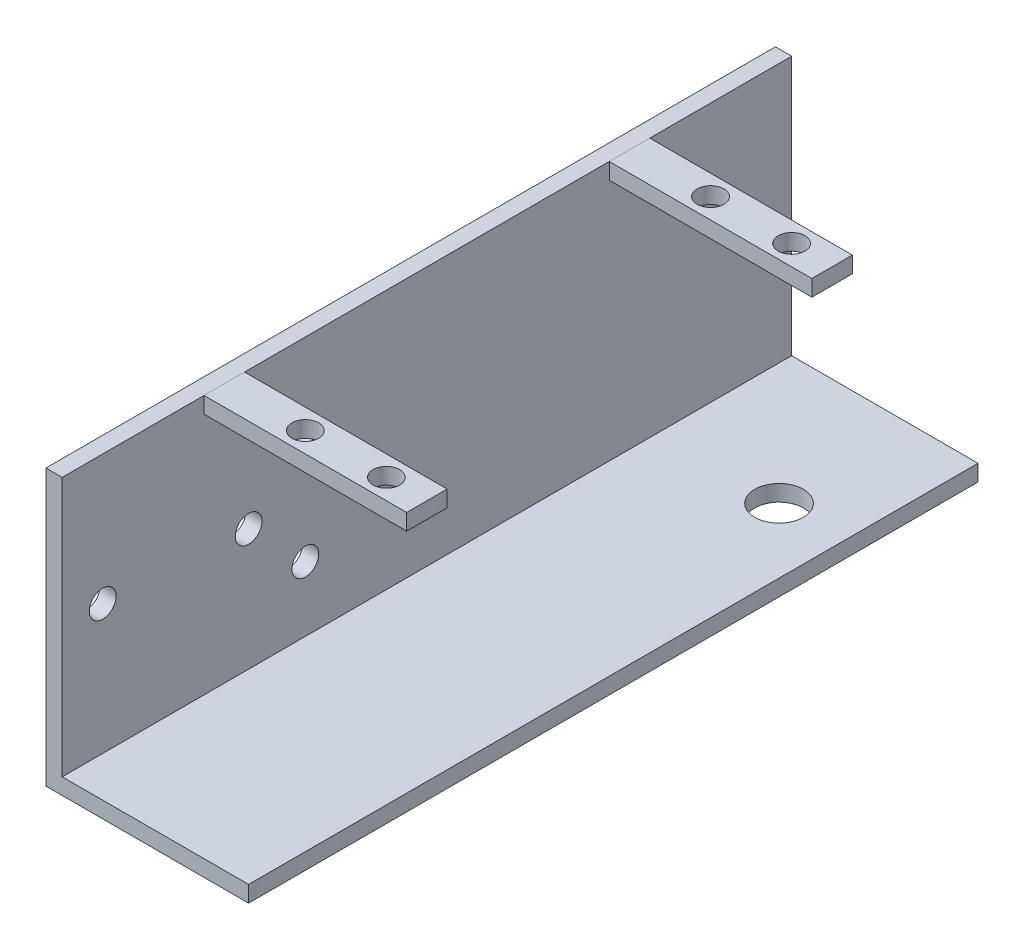
ISO-10303-21;
HEADER;
FILE_DESCRIPTION(('STEP AP214'),'2;1');
FILE_NAME('part.step','',(''),(''),'','','');
FILE_SCHEMA(('AUTOMOTIVE_DESIGN { 1 0 10303 214 1 1 1 1 }'));
ENDSEC;
DATA;
#1=APPLICATION_CONTEXT('core data for automotive mechanical design processes');
#2=APPLICATION_PROTOCOL_DEFINITION('international standard','automotive_design',2000,#1);
#3=PRODUCT_CONTEXT('',#1,'mechanical');
#4=PRODUCT('Part','Part','',(#3));
#5=PRODUCT_RELATED_PRODUCT_CATEGORY('part','',(#4));
#6=PRODUCT_DEFINITION_FORMATION('','',#4);
#7=PRODUCT_DEFINITION_CONTEXT('part definition',#1,'design');
#8=PRODUCT_DEFINITION('design','',#6,#7);
#9=PRODUCT_DEFINITION_SHAPE('','',#8);
#10=(LENGTH_UNIT() NAMED_UNIT(*) SI_UNIT(.MILLI.,.METRE.));
#11=(NAMED_UNIT(*) PLANE_ANGLE_UNIT() SI_UNIT($,.RADIAN.));
#12=(NAMED_UNIT(*) SI_UNIT($,.STERADIAN.) SOLID_ANGLE_UNIT());
#13=UNCERTAINTY_MEASURE_WITH_UNIT(LENGTH_MEASURE(1.E-05),#10,'distance_accuracy_value','');
#14=(GEOMETRIC_REPRESENTATION_CONTEXT(3) GLOBAL_UNCERTAINTY_ASSIGNED_CONTEXT((#13)) GLOBAL_UNIT_ASSIGNED_CONTEXT((#10,
#11,#12)) REPRESENTATION_CONTEXT('',''));
#15=CARTESIAN_POINT('',(0.,0.,0.));
#16=DIRECTION('',(0.,0.,1.));
#17=DIRECTION('',(1.,0.,0.));
#18=AXIS2_PLACEMENT_3D('',#15,#16,#17);
#19=CARTESIAN_POINT('',(14.5,32.,-22.5));
#20=DIRECTION('',(0.,0.,-1.));
#21=DIRECTION('',(0.,1.,0.));
#22=AXIS2_PLACEMENT_3D('',#19,#20,#21);
#23=PLANE('',#22);
#24=DIRECTION('',(0.,-1.,0.));
#25=VECTOR('',#24,1.);
#26=CARTESIAN_POINT('',(-10.5,32.,-22.5));
#27=LINE('',#26,#25);
#28=CARTESIAN_POINT('',(-10.5,34.,-22.5));
#29=VERTEX_POINT('',#28);
#30=CARTESIAN_POINT('',(-10.5,32.,-22.5));
#31=VERTEX_POINT('',#30);
#32=EDGE_CURVE('E113',#29,#31,#27,.T.);
#33=ORIENTED_EDGE('',*,*,#32,.T.);
#34=DIRECTION('',(-1.,0.,0.));
#35=VECTOR('',#34,1.);
#36=CARTESIAN_POINT('',(14.5,32.,-22.5));
#37=LINE('',#36,#35);
#38=CARTESIAN_POINT('',(14.5,32.,-22.5));
#39=VERTEX_POINT('',#38);
#40=EDGE_CURVE('E12',#39,#31,#37,.T.);
#41=ORIENTED_EDGE('',*,*,#40,.F.);
#42=DIRECTION('',(0.,-1.,0.));
#43=VECTOR('',#42,1.);
#44=CARTESIAN_POINT('',(14.5,32.,-22.5));
#45=LINE('',#44,#43);
#46=CARTESIAN_POINT('',(14.5,34.,-22.5));
#47=VERTEX_POINT('',#46);
#48=EDGE_CURVE('E101',#47,#39,#45,.T.);
#49=ORIENTED_EDGE('',*,*,#48,.F.);
#50=DIRECTION('',(-1.,0.,0.));
#51=VECTOR('',#50,1.);
#52=CARTESIAN_POINT('',(14.5,34.,-22.5));
#53=LINE('',#52,#51);
#54=EDGE_CURVE('E109',#47,#29,#53,.T.);
#55=ORIENTED_EDGE('',*,*,#54,.T.);
#56=EDGE_LOOP('',(#33,#41,#49,#55));
#57=FACE_BOUND('',#56,.T.);
#58=ADVANCED_FACE('F50',(#57),#23,.F.);
#59=CARTESIAN_POINT('',(14.5,32.,-22.5));
#60=DIRECTION('',(0.,1.,0.));
#61=DIRECTION('',(0.,0.,1.));
#62=AXIS2_PLACEMENT_3D('',#59,#60,#61);
#63=PLANE('',#62);
#64=CARTESIAN_POINT('',(9.50000000000001,32.,-25.));
#65=DIRECTION('',(0.,1.,0.));
#66=DIRECTION('',(0.,0.,1.));
#67=AXIS2_PLACEMENT_3D('',#64,#65,#66);
#68=CIRCLE('',#67,1.65);
#69=CARTESIAN_POINT('',(9.50000000000001,32.,-23.35));
#70=VERTEX_POINT('',#69);
#71=EDGE_CURVE('E116',#70,#70,#68,.F.);
#72=ORIENTED_EDGE('',*,*,#71,.F.);
#73=EDGE_LOOP('',(#72));
#74=FACE_BOUND('',#73,.T.);
#75=CARTESIAN_POINT('',(-0.499999999999994,32.,-25.));
#76=DIRECTION('',(0.,1.,0.));
#77=DIRECTION('',(0.,0.,1.));
#78=AXIS2_PLACEMENT_3D('',#75,#76,#77);
#79=CIRCLE('',#78,1.65);
#80=CARTESIAN_POINT('',(-0.499999999999994,32.,-23.35));
#81=VERTEX_POINT('',#80);
#82=EDGE_CURVE('E127',#81,#81,#79,.F.);
#83=ORIENTED_EDGE('',*,*,#82,.F.);
#84=EDGE_LOOP('',(#83));
#85=FACE_BOUND('',#84,.T.);
#86=DIRECTION('',(0.,0.,-1.));
#87=VECTOR('',#86,1.);
#88=CARTESIAN_POINT('',(-10.5,32.,-22.5));
#89=LINE('',#88,#87);
#90=CARTESIAN_POINT('',(-10.5,32.,-27.5));
#91=VERTEX_POINT('',#90);
#92=EDGE_CURVE('E105',#31,#91,#89,.T.);
#93=ORIENTED_EDGE('',*,*,#92,.T.);
#94=DIRECTION('',(-1.,0.,0.));
#95=VECTOR('',#94,1.);
#96=CARTESIAN_POINT('',(14.5,32.,-27.5));
#97=LINE('',#96,#95);
#98=CARTESIAN_POINT('',(14.5,32.,-27.5));
#99=VERTEX_POINT('',#98);
#100=EDGE_CURVE('E58',#99,#91,#97,.T.);
#101=ORIENTED_EDGE('',*,*,#100,.F.);
#102=DIRECTION('',(0.,0.,-1.));
#103=VECTOR('',#102,1.);
#104=CARTESIAN_POINT('',(14.5,32.,-22.5));
#105=LINE('',#104,#103);
#106=EDGE_CURVE('E96',#39,#99,#105,.T.);
#107=ORIENTED_EDGE('',*,*,#106,.F.);
#108=ORIENTED_EDGE('',*,*,#40,.T.);
#109=EDGE_LOOP('',(#93,#101,#107,#108));
#110=FACE_BOUND('',#109,.T.);
#111=ADVANCED_FACE('F104',(#74,#85,#110),#63,.F.);
#112=CARTESIAN_POINT('',(14.5,32.,-27.5));
#113=DIRECTION('',(0.,0.,1.));
#114=DIRECTION('',(1.,0.,0.));
#115=AXIS2_PLACEMENT_3D('',#112,#113,#114);
#116=PLANE('',#115);
#117=DIRECTION('',(0.,1.,0.));
#118=VECTOR('',#117,1.);
#119=CARTESIAN_POINT('',(-10.5,32.,-27.5));
#120=LINE('',#119,#118);
#121=CARTESIAN_POINT('',(-10.5,34.,-27.5));
#122=VERTEX_POINT('',#121);
#123=EDGE_CURVE('E83',#91,#122,#120,.T.);
#124=ORIENTED_EDGE('',*,*,#123,.T.);
#125=DIRECTION('',(-1.,0.,0.));
#126=VECTOR('',#125,1.);
#127=CARTESIAN_POINT('',(14.5,34.,-27.5));
#128=LINE('',#127,#126);
#129=CARTESIAN_POINT('',(14.5,34.,-27.5));
#130=VERTEX_POINT('',#129);
#131=EDGE_CURVE('E106',#130,#122,#128,.T.);
#132=ORIENTED_EDGE('',*,*,#131,.F.);
#133=DIRECTION('',(0.,1.,0.));
#134=VECTOR('',#133,1.);
#135=CARTESIAN_POINT('',(14.5,32.,-27.5));
#136=LINE('',#135,#134);
#137=EDGE_CURVE('E99',#99,#130,#136,.T.);
#138=ORIENTED_EDGE('',*,*,#137,.F.);
#139=ORIENTED_EDGE('',*,*,#100,.T.);
#140=EDGE_LOOP('',(#124,#132,#138,#139));
#141=FACE_BOUND('',#140,.T.);
#142=ADVANCED_FACE('F107',(#141),#116,.F.);
#143=CARTESIAN_POINT('',(14.5,34.,-22.5));
#144=DIRECTION('',(0.,-1.,0.));
#145=DIRECTION('',(0.,0.,-1.));
#146=AXIS2_PLACEMENT_3D('',#143,#144,#145);
#147=PLANE('',#146);
#148=CARTESIAN_POINT('',(9.50000000000001,34.,-25.));
#149=DIRECTION('',(0.,1.,0.));
#150=DIRECTION('',(0.,0.,-1.));
#151=AXIS2_PLACEMENT_3D('',#148,#149,#150);
#152=CIRCLE('',#151,1.65);
#153=CARTESIAN_POINT('',(9.50000000000001,34.,-26.65));
#154=VERTEX_POINT('',#153);
#155=EDGE_CURVE('E130',#154,#154,#152,.T.);
#156=ORIENTED_EDGE('',*,*,#155,.F.);
#157=EDGE_LOOP('',(#156));
#158=FACE_BOUND('',#157,.T.);
#159=CARTESIAN_POINT('',(-0.499999999999994,34.,-25.));
#160=DIRECTION('',(0.,1.,0.));
#161=DIRECTION('',(0.,0.,-1.));
#162=AXIS2_PLACEMENT_3D('',#159,#160,#161);
#163=CIRCLE('',#162,1.65);
#164=CARTESIAN_POINT('',(-0.499999999999994,34.,-26.65));
#165=VERTEX_POINT('',#164);
#166=EDGE_CURVE('E131',#165,#165,#163,.T.);
#167=ORIENTED_EDGE('',*,*,#166,.F.);
#168=EDGE_LOOP('',(#167));
#169=FACE_BOUND('',#168,.T.);
#170=DIRECTION('',(0.,0.,1.));
#171=VECTOR('',#170,1.);
#172=CARTESIAN_POINT('',(-10.5,34.,-22.5));
#173=LINE('',#172,#171);
#174=EDGE_CURVE('E89',#122,#29,#173,.T.);
#175=ORIENTED_EDGE('',*,*,#174,.T.);
#176=ORIENTED_EDGE('',*,*,#54,.F.);
#177=DIRECTION('',(0.,0.,1.));
#178=VECTOR('',#177,1.);
#179=CARTESIAN_POINT('',(14.5,34.,-22.5));
#180=LINE('',#179,#178);
#181=EDGE_CURVE('E66',#130,#47,#180,.T.);
#182=ORIENTED_EDGE('',*,*,#181,.F.);
#183=ORIENTED_EDGE('',*,*,#131,.T.);
#184=EDGE_LOOP('',(#175,#176,#182,#183));
#185=FACE_BOUND('',#184,.T.);
#186=ADVANCED_FACE('F121',(#158,#169,#185),#147,.F.);
#187=CARTESIAN_POINT('',(14.5,0.,0.));
#188=DIRECTION('',(-1.,0.,0.));
#189=DIRECTION('',(0.,0.,1.));
#190=AXIS2_PLACEMENT_3D('',#187,#188,#189);
#191=PLANE('',#190);
#192=ORIENTED_EDGE('',*,*,#48,.T.);
#193=ORIENTED_EDGE('',*,*,#106,.T.);
#194=ORIENTED_EDGE('',*,*,#137,.T.);
#195=ORIENTED_EDGE('',*,*,#181,.T.);
#196=EDGE_LOOP('',(#192,#193,#194,#195));
#197=FACE_BOUND('',#196,.T.);
#198=ADVANCED_FACE('F97',(#197),#191,.F.);
#199=CARTESIAN_POINT('',(-10.5,0.,0.));
#200=DIRECTION('',(-1.,0.,0.));
#201=DIRECTION('',(0.,0.,1.));
#202=AXIS2_PLACEMENT_3D('',#199,#200,#201);
#203=PLANE('',#202);
#204=ORIENTED_EDGE('',*,*,#32,.F.);
#205=ORIENTED_EDGE('',*,*,#174,.F.);
#206=ORIENTED_EDGE('',*,*,#123,.F.);
#207=ORIENTED_EDGE('',*,*,#92,.F.);
#208=EDGE_LOOP('',(#204,#205,#206,#207));
#209=FACE_BOUND('',#208,.T.);
#210=ADVANCED_FACE('F124',(#209),#203,.T.);
#211=CARTESIAN_POINT('',(-0.499999999999994,-0.001000000000001,-25.));
#212=DIRECTION('',(0.,1.,0.));
#213=DIRECTION('',(0.,0.,1.));
#214=AXIS2_PLACEMENT_3D('',#211,#212,#213);
#215=CYLINDRICAL_SURFACE('',#214,1.65);
#216=ORIENTED_EDGE('',*,*,#166,.T.);
#217=EDGE_LOOP('',(#216));
#218=FACE_BOUND('',#217,.T.);
#219=ORIENTED_EDGE('',*,*,#82,.T.);
#220=EDGE_LOOP('',(#219));
#221=FACE_BOUND('',#220,.T.);
#222=ADVANCED_FACE('F147',(#218,#221),#215,.F.);
#223=CARTESIAN_POINT('',(9.50000000000001,-0.001000000000001,-25.));
#224=DIRECTION('',(0.,1.,0.));
#225=DIRECTION('',(0.,0.,1.));
#226=AXIS2_PLACEMENT_3D('',#223,#224,#225);
#227=CYLINDRICAL_SURFACE('',#226,1.65);
#228=ORIENTED_EDGE('',*,*,#155,.T.);
#229=EDGE_LOOP('',(#228));
#230=FACE_BOUND('',#229,.T.);
#231=ORIENTED_EDGE('',*,*,#71,.T.);
#232=EDGE_LOOP('',(#231));
#233=FACE_BOUND('',#232,.T.);
#234=ADVANCED_FACE('F139',(#230,#233),#227,.F.);
#235=CLOSED_SHELL('',(#58,#111,#142,#186,#198,#210,#222,#234));
#236=MANIFOLD_SOLID_BREP('B2',#235);
#237=CARTESIAN_POINT('',(14.5,32.,22.5));
#238=DIRECTION('',(0.,0.,1.));
#239=DIRECTION('',(1.,0.,0.));
#240=AXIS2_PLACEMENT_3D('',#237,#238,#239);
#241=PLANE('',#240);
#242=DIRECTION('',(0.,1.,0.));
#243=VECTOR('',#242,1.);
#244=CARTESIAN_POINT('',(-10.5,32.,22.5));
#245=LINE('',#244,#243);
#246=CARTESIAN_POINT('',(-10.5,32.,22.5));
#247=VERTEX_POINT('',#246);
#248=CARTESIAN_POINT('',(-10.5,34.,22.5));
#249=VERTEX_POINT('',#248);
#250=EDGE_CURVE('E288',#247,#249,#245,.T.);
#251=ORIENTED_EDGE('',*,*,#250,.T.);
#252=DIRECTION('',(-1.,0.,0.));
#253=VECTOR('',#252,1.);
#254=CARTESIAN_POINT('',(14.5,34.,22.5));
#255=LINE('',#254,#253);
#256=CARTESIAN_POINT('',(14.5,34.,22.5));
#257=VERTEX_POINT('',#256);
#258=EDGE_CURVE('E48',#257,#249,#255,.T.);
#259=ORIENTED_EDGE('',*,*,#258,.F.);
#260=DIRECTION('',(0.,1.,0.));
#261=VECTOR('',#260,1.);
#262=CARTESIAN_POINT('',(14.5,32.,22.5));
#263=LINE('',#262,#261);
#264=CARTESIAN_POINT('',(14.5,32.,22.5));
#265=VERTEX_POINT('',#264);
#266=EDGE_CURVE('E276',#265,#257,#263,.T.);
#267=ORIENTED_EDGE('',*,*,#266,.F.);
#268=DIRECTION('',(-1.,0.,0.));
#269=VECTOR('',#268,1.);
#270=CARTESIAN_POINT('',(14.5,32.,22.5));
#271=LINE('',#270,#269);
#272=EDGE_CURVE('E284',#265,#247,#271,.T.);
#273=ORIENTED_EDGE('',*,*,#272,.T.);
#274=EDGE_LOOP('',(#251,#259,#267,#273));
#275=FACE_BOUND('',#274,.T.);
#276=ADVANCED_FACE('F225',(#275),#241,.F.);
#277=CARTESIAN_POINT('',(14.5,34.,22.5));
#278=DIRECTION('',(0.,-1.,0.));
#279=DIRECTION('',(0.,0.,-1.));
#280=AXIS2_PLACEMENT_3D('',#277,#278,#279);
#281=PLANE('',#280);
#282=CARTESIAN_POINT('',(-0.499999999999994,34.,25.));
#283=DIRECTION('',(0.,1.,0.));
#284=DIRECTION('',(0.,0.,1.));
#285=AXIS2_PLACEMENT_3D('',#282,#283,#284);
#286=CIRCLE('',#285,1.65);
#287=CARTESIAN_POINT('',(-0.499999999999994,34.,26.65));
#288=VERTEX_POINT('',#287);
#289=EDGE_CURVE('E305',#288,#288,#286,.T.);
#290=ORIENTED_EDGE('',*,*,#289,.F.);
#291=EDGE_LOOP('',(#290));
#292=FACE_BOUND('',#291,.T.);
#293=CARTESIAN_POINT('',(9.50000000000001,34.,25.));
#294=DIRECTION('',(0.,1.,0.));
#295=DIRECTION('',(0.,0.,1.));
#296=AXIS2_PLACEMENT_3D('',#293,#294,#295);
#297=CIRCLE('',#296,1.65);
#298=CARTESIAN_POINT('',(9.50000000000001,34.,26.65));
#299=VERTEX_POINT('',#298);
#300=EDGE_CURVE('E306',#299,#299,#297,.T.);
#301=ORIENTED_EDGE('',*,*,#300,.F.);
#302=EDGE_LOOP('',(#301));
#303=FACE_BOUND('',#302,.T.);
#304=DIRECTION('',(0.,0.,1.));
#305=VECTOR('',#304,1.);
#306=CARTESIAN_POINT('',(-10.5,34.,22.5));
#307=LINE('',#306,#305);
#308=CARTESIAN_POINT('',(-10.5,34.,27.5));
#309=VERTEX_POINT('',#308);
#310=EDGE_CURVE('E280',#249,#309,#307,.T.);
#311=ORIENTED_EDGE('',*,*,#310,.T.);
#312=DIRECTION('',(-1.,0.,0.));
#313=VECTOR('',#312,1.);
#314=CARTESIAN_POINT('',(14.5,34.,27.5));
#315=LINE('',#314,#313);
#316=CARTESIAN_POINT('',(14.5,34.,27.5));
#317=VERTEX_POINT('',#316);
#318=EDGE_CURVE('E233',#317,#309,#315,.T.);
#319=ORIENTED_EDGE('',*,*,#318,.F.);
#320=DIRECTION('',(0.,0.,1.));
#321=VECTOR('',#320,1.);
#322=CARTESIAN_POINT('',(14.5,34.,22.5));
#323=LINE('',#322,#321);
#324=EDGE_CURVE('E271',#257,#317,#323,.T.);
#325=ORIENTED_EDGE('',*,*,#324,.F.);
#326=ORIENTED_EDGE('',*,*,#258,.T.);
#327=EDGE_LOOP('',(#311,#319,#325,#326));
#328=FACE_BOUND('',#327,.T.);
#329=ADVANCED_FACE('F279',(#292,#303,#328),#281,.F.);
#330=CARTESIAN_POINT('',(14.5,32.,27.5));
#331=DIRECTION('',(0.,0.,-1.));
#332=DIRECTION('',(-1.,0.,0.));
#333=AXIS2_PLACEMENT_3D('',#330,#331,#332);
#334=PLANE('',#333);
#335=DIRECTION('',(0.,-1.,0.));
#336=VECTOR('',#335,1.);
#337=CARTESIAN_POINT('',(-10.5,32.,27.5));
#338=LINE('',#337,#336);
#339=CARTESIAN_POINT('',(-10.5,32.,27.5));
#340=VERTEX_POINT('',#339);
#341=EDGE_CURVE('E258',#309,#340,#338,.T.);
#342=ORIENTED_EDGE('',*,*,#341,.T.);
#343=DIRECTION('',(-1.,0.,0.));
#344=VECTOR('',#343,1.);
#345=CARTESIAN_POINT('',(14.5,32.,27.5));
#346=LINE('',#345,#344);
#347=CARTESIAN_POINT('',(14.5,32.,27.5));
#348=VERTEX_POINT('',#347);
#349=EDGE_CURVE('E281',#348,#340,#346,.T.);
#350=ORIENTED_EDGE('',*,*,#349,.F.);
#351=DIRECTION('',(0.,-1.,0.));
#352=VECTOR('',#351,1.);
#353=CARTESIAN_POINT('',(14.5,32.,27.5));
#354=LINE('',#353,#352);
#355=EDGE_CURVE('E274',#317,#348,#354,.T.);
#356=ORIENTED_EDGE('',*,*,#355,.F.);
#357=ORIENTED_EDGE('',*,*,#318,.T.);
#358=EDGE_LOOP('',(#342,#350,#356,#357));
#359=FACE_BOUND('',#358,.T.);
#360=ADVANCED_FACE('F282',(#359),#334,.F.);
#361=CARTESIAN_POINT('',(14.5,32.,22.5));
#362=DIRECTION('',(0.,1.,0.));
#363=DIRECTION('',(0.,0.,1.));
#364=AXIS2_PLACEMENT_3D('',#361,#362,#363);
#365=PLANE('',#364);
#366=CARTESIAN_POINT('',(-0.499999999999994,32.,25.));
#367=DIRECTION('',(0.,1.,0.));
#368=DIRECTION('',(0.,0.,1.));
#369=AXIS2_PLACEMENT_3D('',#366,#367,#368);
#370=CIRCLE('',#369,1.65);
#371=CARTESIAN_POINT('',(-0.499999999999994,32.,26.65));
#372=VERTEX_POINT('',#371);
#373=EDGE_CURVE('E291',#372,#372,#370,.F.);
#374=ORIENTED_EDGE('',*,*,#373,.F.);
#375=EDGE_LOOP('',(#374));
#376=FACE_BOUND('',#375,.T.);
#377=CARTESIAN_POINT('',(9.50000000000001,32.,25.));
#378=DIRECTION('',(0.,1.,0.));
#379=DIRECTION('',(0.,0.,1.));
#380=AXIS2_PLACEMENT_3D('',#377,#378,#379);
#381=CIRCLE('',#380,1.65);
#382=CARTESIAN_POINT('',(9.50000000000001,32.,26.65));
#383=VERTEX_POINT('',#382);
#384=EDGE_CURVE('E302',#383,#383,#381,.F.);
#385=ORIENTED_EDGE('',*,*,#384,.F.);
#386=EDGE_LOOP('',(#385));
#387=FACE_BOUND('',#386,.T.);
#388=DIRECTION('',(0.,0.,-1.));
#389=VECTOR('',#388,1.);
#390=CARTESIAN_POINT('',(-10.5,32.,22.5));
#391=LINE('',#390,#389);
#392=EDGE_CURVE('E264',#340,#247,#391,.T.);
#393=ORIENTED_EDGE('',*,*,#392,.T.);
#394=ORIENTED_EDGE('',*,*,#272,.F.);
#395=DIRECTION('',(0.,0.,-1.));
#396=VECTOR('',#395,1.);
#397=CARTESIAN_POINT('',(14.5,32.,22.5));
#398=LINE('',#397,#396);
#399=EDGE_CURVE('E241',#348,#265,#398,.T.);
#400=ORIENTED_EDGE('',*,*,#399,.F.);
#401=ORIENTED_EDGE('',*,*,#349,.T.);
#402=EDGE_LOOP('',(#393,#394,#400,#401));
#403=FACE_BOUND('',#402,.T.);
#404=ADVANCED_FACE('F296',(#376,#387,#403),#365,.F.);
#405=CARTESIAN_POINT('',(14.5,0.,0.));
#406=DIRECTION('',(1.,0.,0.));
#407=DIRECTION('',(0.,0.,-1.));
#408=AXIS2_PLACEMENT_3D('',#405,#406,#407);
#409=PLANE('',#408);
#410=ORIENTED_EDGE('',*,*,#266,.T.);
#411=ORIENTED_EDGE('',*,*,#324,.T.);
#412=ORIENTED_EDGE('',*,*,#355,.T.);
#413=ORIENTED_EDGE('',*,*,#399,.T.);
#414=EDGE_LOOP('',(#410,#411,#412,#413));
#415=FACE_BOUND('',#414,.T.);
#416=ADVANCED_FACE('F272',(#415),#409,.T.);
#417=CARTESIAN_POINT('',(-10.5,0.,0.));
#418=DIRECTION('',(1.,0.,0.));
#419=DIRECTION('',(0.,0.,-1.));
#420=AXIS2_PLACEMENT_3D('',#417,#418,#419);
#421=PLANE('',#420);
#422=ORIENTED_EDGE('',*,*,#250,.F.);
#423=ORIENTED_EDGE('',*,*,#392,.F.);
#424=ORIENTED_EDGE('',*,*,#341,.F.);
#425=ORIENTED_EDGE('',*,*,#310,.F.);
#426=EDGE_LOOP('',(#422,#423,#424,#425));
#427=FACE_BOUND('',#426,.T.);
#428=ADVANCED_FACE('F299',(#427),#421,.F.);
#429=CARTESIAN_POINT('',(9.50000000000001,-0.001000000000001,25.));
#430=DIRECTION('',(0.,1.,0.));
#431=DIRECTION('',(0.,0.,1.));
#432=AXIS2_PLACEMENT_3D('',#429,#430,#431);
#433=CYLINDRICAL_SURFACE('',#432,1.65);
#434=ORIENTED_EDGE('',*,*,#300,.T.);
#435=EDGE_LOOP('',(#434));
#436=FACE_BOUND('',#435,.T.);
#437=ORIENTED_EDGE('',*,*,#384,.T.);
#438=EDGE_LOOP('',(#437));
#439=FACE_BOUND('',#438,.T.);
#440=ADVANCED_FACE('F321',(#436,#439),#433,.F.);
#441=CARTESIAN_POINT('',(-0.499999999999994,-0.001000000000001,25.));
#442=DIRECTION('',(0.,1.,0.));
#443=DIRECTION('',(0.,0.,1.));
#444=AXIS2_PLACEMENT_3D('',#441,#442,#443);
#445=CYLINDRICAL_SURFACE('',#444,1.65);
#446=ORIENTED_EDGE('',*,*,#289,.T.);
#447=EDGE_LOOP('',(#446));
#448=FACE_BOUND('',#447,.T.);
#449=ORIENTED_EDGE('',*,*,#373,.T.);
#450=EDGE_LOOP('',(#449));
#451=FACE_BOUND('',#450,.T.);
#452=ADVANCED_FACE('F314',(#448,#451),#445,.F.);
#453=CLOSED_SHELL('',(#276,#329,#360,#404,#416,#428,#440,#452));
#454=MANIFOLD_SOLID_BREP('B6',#453);
#455=CARTESIAN_POINT('',(0.,2.,0.));
#456=DIRECTION('',(0.,-1.,0.));
#457=DIRECTION('',(0.,0.,-1.));
#458=AXIS2_PLACEMENT_3D('',#455,#456,#457);
#459=PLANE('',#458);
#460=CARTESIAN_POINT('',(4.5,2.,-28.45));
#461=DIRECTION('',(0.,-1.,0.));
#462=DIRECTION('',(0.,0.,-1.));
#463=AXIS2_PLACEMENT_3D('',#460,#461,#462);
#464=CIRCLE('',#463,3.);
#465=CARTESIAN_POINT('',(4.5,2.,-31.45));
#466=VERTEX_POINT('',#465);
#467=EDGE_CURVE('E547',#466,#466,#464,.T.);
#468=ORIENTED_EDGE('',*,*,#467,.T.);
#469=EDGE_LOOP('',(#468));
#470=FACE_BOUND('',#469,.T.);
#471=DIRECTION('',(0.,0.,-1.));
#472=VECTOR('',#471,1.);
#473=CARTESIAN_POINT('',(-10.5,2.,-45.));
#474=LINE('',#473,#472);
#475=CARTESIAN_POINT('',(-10.5,2.,45.));
#476=VERTEX_POINT('',#475);
#477=CARTESIAN_POINT('',(-10.5,2.,-45.));
#478=VERTEX_POINT('',#477);
#479=EDGE_CURVE('E409',#476,#478,#474,.T.);
#480=ORIENTED_EDGE('',*,*,#479,.F.);
#481=DIRECTION('',(1.,0.,0.));
#482=VECTOR('',#481,1.);
#483=CARTESIAN_POINT('',(-12.5,2.,45.));
#484=LINE('',#483,#482);
#485=CARTESIAN_POINT('',(12.5,2.,45.));
#486=VERTEX_POINT('',#485);
#487=EDGE_CURVE('E414',#476,#486,#484,.T.);
#488=ORIENTED_EDGE('',*,*,#487,.T.);
#489=DIRECTION('',(0.,0.,-1.));
#490=VECTOR('',#489,1.);
#491=CARTESIAN_POINT('',(12.5,2.,45.));
#492=LINE('',#491,#490);
#493=CARTESIAN_POINT('',(12.5,2.,-45.));
#494=VERTEX_POINT('',#493);
#495=EDGE_CURVE('E446',#486,#494,#492,.T.);
#496=ORIENTED_EDGE('',*,*,#495,.T.);
#497=DIRECTION('',(-1.,0.,0.));
#498=VECTOR('',#497,1.);
#499=CARTESIAN_POINT('',(-12.5,2.,-45.));
#500=LINE('',#499,#498);
#501=EDGE_CURVE('E511',#494,#478,#500,.T.);
#502=ORIENTED_EDGE('',*,*,#501,.T.);
#503=EDGE_LOOP('',(#480,#488,#496,#502));
#504=FACE_BOUND('',#503,.T.);
#505=ADVANCED_FACE('F391',(#470,#504),#459,.F.);
#506=CARTESIAN_POINT('',(12.5,2.,45.));
#507=DIRECTION('',(-1.,0.,0.));
#508=DIRECTION('',(0.,0.,1.));
#509=AXIS2_PLACEMENT_3D('',#506,#507,#508);
#510=PLANE('',#509);
#511=DIRECTION('',(0.,0.,-1.));
#512=VECTOR('',#511,1.);
#513=CARTESIAN_POINT('',(12.5,0.,45.));
#514=LINE('',#513,#512);
#515=CARTESIAN_POINT('',(12.5,0.,45.));
#516=VERTEX_POINT('',#515);
#517=CARTESIAN_POINT('',(12.5,0.,-45.));
#518=VERTEX_POINT('',#517);
#519=EDGE_CURVE('E452',#516,#518,#514,.T.);
#520=ORIENTED_EDGE('',*,*,#519,.T.);
#521=DIRECTION('',(0.,-1.,0.));
#522=VECTOR('',#521,1.);
#523=CARTESIAN_POINT('',(12.5,2.,-45.));
#524=LINE('',#523,#522);
#525=EDGE_CURVE('E223',#494,#518,#524,.T.);
#526=ORIENTED_EDGE('',*,*,#525,.F.);
#527=ORIENTED_EDGE('',*,*,#495,.F.);
#528=DIRECTION('',(0.,-1.,0.));
#529=VECTOR('',#528,1.);
#530=CARTESIAN_POINT('',(12.5,2.,45.));
#531=LINE('',#530,#529);
#532=EDGE_CURVE('E437',#486,#516,#531,.T.);
#533=ORIENTED_EDGE('',*,*,#532,.T.);
#534=EDGE_LOOP('',(#520,#526,#527,#533));
#535=FACE_BOUND('',#534,.T.);
#536=ADVANCED_FACE('F393',(#535),#510,.F.);
#537=CARTESIAN_POINT('',(-12.5,2.,-45.));
#538=DIRECTION('',(0.,0.,1.));
#539=DIRECTION('',(1.,0.,0.));
#540=AXIS2_PLACEMENT_3D('',#537,#538,#539);
#541=PLANE('',#540);
#542=DIRECTION('',(-1.,0.,0.));
#543=VECTOR('',#542,1.);
#544=CARTESIAN_POINT('',(-12.5,0.,-45.));
#545=LINE('',#544,#543);
#546=CARTESIAN_POINT('',(-12.5,0.,-45.));
#547=VERTEX_POINT('',#546);
#548=EDGE_CURVE('E456',#518,#547,#545,.T.);
#549=ORIENTED_EDGE('',*,*,#548,.T.);
#550=DIRECTION('',(0.,-1.,0.));
#551=VECTOR('',#550,1.);
#552=CARTESIAN_POINT('',(-12.5,2.,-45.));
#553=LINE('',#552,#551);
#554=CARTESIAN_POINT('',(-12.5,34.,-45.));
#555=VERTEX_POINT('',#554);
#556=EDGE_CURVE('E401',#555,#547,#553,.T.);
#557=ORIENTED_EDGE('',*,*,#556,.F.);
#558=DIRECTION('',(-1.,0.,0.));
#559=VECTOR('',#558,1.);
#560=CARTESIAN_POINT('',(-12.5,34.,-45.));
#561=LINE('',#560,#559);
#562=CARTESIAN_POINT('',(-10.5,34.,-45.));
#563=VERTEX_POINT('',#562);
#564=EDGE_CURVE('E506',#563,#555,#561,.T.);
#565=ORIENTED_EDGE('',*,*,#564,.F.);
#566=DIRECTION('',(0.,-1.,0.));
#567=VECTOR('',#566,1.);
#568=CARTESIAN_POINT('',(-10.5,34.,-45.));
#569=LINE('',#568,#567);
#570=EDGE_CURVE('E464',#563,#478,#569,.T.);
#571=ORIENTED_EDGE('',*,*,#570,.T.);
#572=ORIENTED_EDGE('',*,*,#501,.F.);
#573=ORIENTED_EDGE('',*,*,#525,.T.);
#574=EDGE_LOOP('',(#549,#557,#565,#571,#572,#573));
#575=FACE_BOUND('',#574,.T.);
#576=ADVANCED_FACE('F516',(#575),#541,.F.);
#577=CARTESIAN_POINT('',(-12.5,2.,45.));
#578=DIRECTION('',(1.,0.,0.));
#579=DIRECTION('',(0.,0.,-1.));
#580=AXIS2_PLACEMENT_3D('',#577,#578,#579);
#581=PLANE('',#580);
#582=CARTESIAN_POINT('',(-12.5,18.,40.));
#583=DIRECTION('',(1.,0.,0.));
#584=DIRECTION('',(0.,0.,-1.));
#585=AXIS2_PLACEMENT_3D('',#582,#583,#584);
#586=CIRCLE('',#585,1.65);
#587=CARTESIAN_POINT('',(-12.5,18.,38.35));
#588=VERTEX_POINT('',#587);
#589=EDGE_CURVE('E565',#588,#588,#586,.T.);
#590=ORIENTED_EDGE('',*,*,#589,.T.);
#591=EDGE_LOOP('',(#590));
#592=FACE_BOUND('',#591,.T.);
#593=CARTESIAN_POINT('',(-12.5,18.,-40.));
#594=DIRECTION('',(1.,0.,0.));
#595=DIRECTION('',(0.,0.,-1.));
#596=AXIS2_PLACEMENT_3D('',#593,#594,#595);
#597=CIRCLE('',#596,1.65);
#598=CARTESIAN_POINT('',(-12.5,18.,-41.65));
#599=VERTEX_POINT('',#598);
#600=EDGE_CURVE('E569',#599,#599,#597,.T.);
#601=ORIENTED_EDGE('',*,*,#600,.T.);
#602=EDGE_LOOP('',(#601));
#603=FACE_BOUND('',#602,.T.);
#604=CARTESIAN_POINT('',(-12.5,17.,8.00000000000001));
#605=DIRECTION('',(-1.,0.,0.));
#606=DIRECTION('',(0.,0.,1.));
#607=AXIS2_PLACEMENT_3D('',#604,#605,#606);
#608=CIRCLE('',#607,1.65);
#609=CARTESIAN_POINT('',(-12.5,17.,9.65000000000001));
#610=VERTEX_POINT('',#609);
#611=EDGE_CURVE('E481',#610,#610,#608,.T.);
#612=ORIENTED_EDGE('',*,*,#611,.F.);
#613=EDGE_LOOP('',(#612));
#614=FACE_BOUND('',#613,.T.);
#615=CARTESIAN_POINT('',(-12.5,17.,22.));
#616=DIRECTION('',(-1.,0.,0.));
#617=DIRECTION('',(0.,0.,-1.));
#618=AXIS2_PLACEMENT_3D('',#615,#616,#617);
#619=CIRCLE('',#618,1.65);
#620=CARTESIAN_POINT('',(-12.5,17.,20.35));
#621=VERTEX_POINT('',#620);
#622=EDGE_CURVE('E551',#621,#621,#619,.T.);
#623=ORIENTED_EDGE('',*,*,#622,.F.);
#624=EDGE_LOOP('',(#623));
#625=FACE_BOUND('',#624,.T.);
#626=CARTESIAN_POINT('',(-12.5,10.,15.));
#627=DIRECTION('',(-1.,0.,0.));
#628=DIRECTION('',(0.,0.,1.));
#629=AXIS2_PLACEMENT_3D('',#626,#627,#628);
#630=CIRCLE('',#629,1.65);
#631=CARTESIAN_POINT('',(-12.5,10.,16.65));
#632=VERTEX_POINT('',#631);
#633=EDGE_CURVE('E546',#632,#632,#630,.T.);
#634=ORIENTED_EDGE('',*,*,#633,.F.);
#635=EDGE_LOOP('',(#634));
#636=FACE_BOUND('',#635,.T.);
#637=CARTESIAN_POINT('',(-12.5,24.,15.));
#638=DIRECTION('',(-1.,0.,0.));
#639=DIRECTION('',(0.,0.,-1.));
#640=AXIS2_PLACEMENT_3D('',#637,#638,#639);
#641=CIRCLE('',#640,1.65);
#642=CARTESIAN_POINT('',(-12.5,24.,13.35));
#643=VERTEX_POINT('',#642);
#644=EDGE_CURVE('E542',#643,#643,#641,.T.);
#645=ORIENTED_EDGE('',*,*,#644,.F.);
#646=EDGE_LOOP('',(#645));
#647=FACE_BOUND('',#646,.T.);
#648=DIRECTION('',(0.,0.,1.));
#649=VECTOR('',#648,1.);
#650=CARTESIAN_POINT('',(-12.5,0.,45.));
#651=LINE('',#650,#649);
#652=CARTESIAN_POINT('',(-12.5,0.,45.));
#653=VERTEX_POINT('',#652);
#654=EDGE_CURVE('E447',#547,#653,#651,.T.);
#655=ORIENTED_EDGE('',*,*,#654,.T.);
#656=DIRECTION('',(0.,-1.,0.));
#657=VECTOR('',#656,1.);
#658=CARTESIAN_POINT('',(-12.5,2.,45.));
#659=LINE('',#658,#657);
#660=CARTESIAN_POINT('',(-12.5,34.,45.));
#661=VERTEX_POINT('',#660);
#662=EDGE_CURVE('E441',#661,#653,#659,.T.);
#663=ORIENTED_EDGE('',*,*,#662,.F.);
#664=DIRECTION('',(0.,0.,1.));
#665=VECTOR('',#664,1.);
#666=CARTESIAN_POINT('',(-12.5,34.,-45.));
#667=LINE('',#666,#665);
#668=EDGE_CURVE('E494',#555,#661,#667,.T.);
#669=ORIENTED_EDGE('',*,*,#668,.F.);
#670=ORIENTED_EDGE('',*,*,#556,.T.);
#671=EDGE_LOOP('',(#655,#663,#669,#670));
#672=FACE_BOUND('',#671,.T.);
#673=ADVANCED_FACE('F534',(#592,#603,#614,#625,#636,#647,#672),#581,.F.);
#674=CARTESIAN_POINT('',(-12.5,2.,45.));
#675=DIRECTION('',(0.,0.,-1.));
#676=DIRECTION('',(-1.,0.,0.));
#677=AXIS2_PLACEMENT_3D('',#674,#675,#676);
#678=PLANE('',#677);
#679=DIRECTION('',(1.,0.,0.));
#680=VECTOR('',#679,1.);
#681=CARTESIAN_POINT('',(-12.5,0.,45.));
#682=LINE('',#681,#680);
#683=EDGE_CURVE('E434',#653,#516,#682,.T.);
#684=ORIENTED_EDGE('',*,*,#683,.T.);
#685=ORIENTED_EDGE('',*,*,#532,.F.);
#686=ORIENTED_EDGE('',*,*,#487,.F.);
#687=DIRECTION('',(0.,-1.,0.));
#688=VECTOR('',#687,1.);
#689=CARTESIAN_POINT('',(-10.5,34.,45.));
#690=LINE('',#689,#688);
#691=CARTESIAN_POINT('',(-10.5,34.,45.));
#692=VERTEX_POINT('',#691);
#693=EDGE_CURVE('E458',#692,#476,#690,.T.);
#694=ORIENTED_EDGE('',*,*,#693,.F.);
#695=DIRECTION('',(1.,0.,0.));
#696=VECTOR('',#695,1.);
#697=CARTESIAN_POINT('',(-12.5,34.,45.));
#698=LINE('',#697,#696);
#699=EDGE_CURVE('E502',#661,#692,#698,.T.);
#700=ORIENTED_EDGE('',*,*,#699,.F.);
#701=ORIENTED_EDGE('',*,*,#662,.T.);
#702=EDGE_LOOP('',(#684,#685,#686,#694,#700,#701));
#703=FACE_BOUND('',#702,.T.);
#704=ADVANCED_FACE('F436',(#703),#678,.F.);
#705=CARTESIAN_POINT('',(0.,0.,0.));
#706=DIRECTION('',(0.,-1.,0.));
#707=DIRECTION('',(0.,0.,-1.));
#708=AXIS2_PLACEMENT_3D('',#705,#706,#707);
#709=PLANE('',#708);
#710=CARTESIAN_POINT('',(4.5,0.,-28.45));
#711=DIRECTION('',(0.,-1.,0.));
#712=DIRECTION('',(0.,0.,-1.));
#713=AXIS2_PLACEMENT_3D('',#710,#711,#712);
#714=CIRCLE('',#713,3.);
#715=CARTESIAN_POINT('',(4.5,0.,-31.45));
#716=VERTEX_POINT('',#715);
#717=EDGE_CURVE('E561',#716,#716,#714,.T.);
#718=ORIENTED_EDGE('',*,*,#717,.F.);
#719=EDGE_LOOP('',(#718));
#720=FACE_BOUND('',#719,.T.);
#721=ORIENTED_EDGE('',*,*,#519,.F.);
#722=ORIENTED_EDGE('',*,*,#683,.F.);
#723=ORIENTED_EDGE('',*,*,#654,.F.);
#724=ORIENTED_EDGE('',*,*,#548,.F.);
#725=EDGE_LOOP('',(#721,#722,#723,#724));
#726=FACE_BOUND('',#725,.T.);
#727=ADVANCED_FACE('F455',(#720,#726),#709,.T.);
#728=CARTESIAN_POINT('',(-10.5,34.,-45.));
#729=DIRECTION('',(-1.,0.,0.));
#730=DIRECTION('',(0.,0.,1.));
#731=AXIS2_PLACEMENT_3D('',#728,#729,#730);
#732=PLANE('',#731);
#733=CARTESIAN_POINT('',(-10.5,18.,40.));
#734=DIRECTION('',(1.,0.,0.));
#735=DIRECTION('',(0.,0.,-1.));
#736=AXIS2_PLACEMENT_3D('',#733,#734,#735);
#737=CIRCLE('',#736,1.65);
#738=CARTESIAN_POINT('',(-10.5,18.,38.35));
#739=VERTEX_POINT('',#738);
#740=EDGE_CURVE('E573',#739,#739,#737,.T.);
#741=ORIENTED_EDGE('',*,*,#740,.F.);
#742=EDGE_LOOP('',(#741));
#743=FACE_BOUND('',#742,.T.);
#744=CARTESIAN_POINT('',(-10.5,18.,-40.));
#745=DIRECTION('',(1.,0.,0.));
#746=DIRECTION('',(0.,0.,-1.));
#747=AXIS2_PLACEMENT_3D('',#744,#745,#746);
#748=CIRCLE('',#747,1.65);
#749=CARTESIAN_POINT('',(-10.5,18.,-41.65));
#750=VERTEX_POINT('',#749);
#751=EDGE_CURVE('E574',#750,#750,#748,.T.);
#752=ORIENTED_EDGE('',*,*,#751,.F.);
#753=EDGE_LOOP('',(#752));
#754=FACE_BOUND('',#753,.T.);
#755=CARTESIAN_POINT('',(-10.5,17.,8.00000000000001));
#756=DIRECTION('',(-1.,0.,0.));
#757=DIRECTION('',(0.,0.,1.));
#758=AXIS2_PLACEMENT_3D('',#755,#756,#757);
#759=CIRCLE('',#758,1.65);
#760=CARTESIAN_POINT('',(-10.5,17.,9.65000000000001));
#761=VERTEX_POINT('',#760);
#762=EDGE_CURVE('E395',#761,#761,#759,.T.);
#763=ORIENTED_EDGE('',*,*,#762,.T.);
#764=EDGE_LOOP('',(#763));
#765=FACE_BOUND('',#764,.T.);
#766=CARTESIAN_POINT('',(-10.5,17.,22.));
#767=DIRECTION('',(-1.,0.,0.));
#768=DIRECTION('',(0.,0.,1.));
#769=AXIS2_PLACEMENT_3D('',#766,#767,#768);
#770=CIRCLE('',#769,1.65);
#771=CARTESIAN_POINT('',(-10.5,17.,23.65));
#772=VERTEX_POINT('',#771);
#773=EDGE_CURVE('E484',#772,#772,#770,.T.);
#774=ORIENTED_EDGE('',*,*,#773,.T.);
#775=EDGE_LOOP('',(#774));
#776=FACE_BOUND('',#775,.T.);
#777=CARTESIAN_POINT('',(-10.5,10.,15.));
#778=DIRECTION('',(-1.,0.,0.));
#779=DIRECTION('',(0.,0.,1.));
#780=AXIS2_PLACEMENT_3D('',#777,#778,#779);
#781=CIRCLE('',#780,1.65);
#782=CARTESIAN_POINT('',(-10.5,10.,16.65));
#783=VERTEX_POINT('',#782);
#784=EDGE_CURVE('E480',#783,#783,#781,.T.);
#785=ORIENTED_EDGE('',*,*,#784,.T.);
#786=EDGE_LOOP('',(#785));
#787=FACE_BOUND('',#786,.T.);
#788=CARTESIAN_POINT('',(-10.5,24.,15.));
#789=DIRECTION('',(-1.,0.,0.));
#790=DIRECTION('',(0.,0.,1.));
#791=AXIS2_PLACEMENT_3D('',#788,#789,#790);
#792=CIRCLE('',#791,1.65);
#793=CARTESIAN_POINT('',(-10.5,24.,16.65));
#794=VERTEX_POINT('',#793);
#795=EDGE_CURVE('E476',#794,#794,#792,.T.);
#796=ORIENTED_EDGE('',*,*,#795,.T.);
#797=EDGE_LOOP('',(#796));
#798=FACE_BOUND('',#797,.T.);
#799=ORIENTED_EDGE('',*,*,#479,.T.);
#800=ORIENTED_EDGE('',*,*,#570,.F.);
#801=DIRECTION('',(0.,0.,-1.));
#802=VECTOR('',#801,1.);
#803=CARTESIAN_POINT('',(-10.5,34.,-45.));
#804=LINE('',#803,#802);
#805=EDGE_CURVE('E525',#692,#563,#804,.T.);
#806=ORIENTED_EDGE('',*,*,#805,.F.);
#807=ORIENTED_EDGE('',*,*,#693,.T.);
#808=EDGE_LOOP('',(#799,#800,#806,#807));
#809=FACE_BOUND('',#808,.T.);
#810=ADVANCED_FACE('F522',(#743,#754,#765,#776,#787,#798,#809),#732,.F.);
#811=CARTESIAN_POINT('',(0.,34.,0.));
#812=DIRECTION('',(0.,1.,0.));
#813=DIRECTION('',(0.,0.,1.));
#814=AXIS2_PLACEMENT_3D('',#811,#812,#813);
#815=PLANE('',#814);
#816=ORIENTED_EDGE('',*,*,#668,.T.);
#817=ORIENTED_EDGE('',*,*,#699,.T.);
#818=ORIENTED_EDGE('',*,*,#805,.T.);
#819=ORIENTED_EDGE('',*,*,#564,.T.);
#820=EDGE_LOOP('',(#816,#817,#818,#819));
#821=FACE_BOUND('',#820,.T.);
#822=ADVANCED_FACE('F538',(#821),#815,.T.);
#823=CARTESIAN_POINT('',(-2.5,24.,15.));
#824=DIRECTION('',(-1.,0.,0.));
#825=DIRECTION('',(0.,0.,1.));
#826=AXIS2_PLACEMENT_3D('',#823,#824,#825);
#827=CYLINDRICAL_SURFACE('',#826,1.65);
#828=ORIENTED_EDGE('',*,*,#644,.T.);
#829=EDGE_LOOP('',(#828));
#830=FACE_BOUND('',#829,.T.);
#831=ORIENTED_EDGE('',*,*,#795,.F.);
#832=EDGE_LOOP('',(#831));
#833=FACE_BOUND('',#832,.T.);
#834=ADVANCED_FACE('F594',(#830,#833),#827,.F.);
#835=CARTESIAN_POINT('',(-2.5,10.,15.));
#836=DIRECTION('',(-1.,0.,0.));
#837=DIRECTION('',(0.,0.,1.));
#838=AXIS2_PLACEMENT_3D('',#835,#836,#837);
#839=CYLINDRICAL_SURFACE('',#838,1.65);
#840=ORIENTED_EDGE('',*,*,#633,.T.);
#841=EDGE_LOOP('',(#840));
#842=FACE_BOUND('',#841,.T.);
#843=ORIENTED_EDGE('',*,*,#784,.F.);
#844=EDGE_LOOP('',(#843));
#845=FACE_BOUND('',#844,.T.);
#846=ADVANCED_FACE('F596',(#842,#845),#839,.F.);
#847=CARTESIAN_POINT('',(-2.5,17.,22.));
#848=DIRECTION('',(-1.,0.,0.));
#849=DIRECTION('',(0.,0.,1.));
#850=AXIS2_PLACEMENT_3D('',#847,#848,#849);
#851=CYLINDRICAL_SURFACE('',#850,1.65);
#852=ORIENTED_EDGE('',*,*,#622,.T.);
#853=EDGE_LOOP('',(#852));
#854=FACE_BOUND('',#853,.T.);
#855=ORIENTED_EDGE('',*,*,#773,.F.);
#856=EDGE_LOOP('',(#855));
#857=FACE_BOUND('',#856,.T.);
#858=ADVANCED_FACE('F603',(#854,#857),#851,.F.);
#859=CARTESIAN_POINT('',(-2.5,17.,8.00000000000001));
#860=DIRECTION('',(-1.,0.,0.));
#861=DIRECTION('',(0.,0.,1.));
#862=AXIS2_PLACEMENT_3D('',#859,#860,#861);
#863=CYLINDRICAL_SURFACE('',#862,1.65);
#864=ORIENTED_EDGE('',*,*,#611,.T.);
#865=EDGE_LOOP('',(#864));
#866=FACE_BOUND('',#865,.T.);
#867=ORIENTED_EDGE('',*,*,#762,.F.);
#868=EDGE_LOOP('',(#867));
#869=FACE_BOUND('',#868,.T.);
#870=ADVANCED_FACE('F667',(#866,#869),#863,.F.);
#871=CARTESIAN_POINT('',(4.5,10.,-28.45));
#872=DIRECTION('',(0.,-1.,0.));
#873=DIRECTION('',(0.,0.,-1.));
#874=AXIS2_PLACEMENT_3D('',#871,#872,#873);
#875=CYLINDRICAL_SURFACE('',#874,3.);
#876=ORIENTED_EDGE('',*,*,#717,.T.);
#877=EDGE_LOOP('',(#876));
#878=FACE_BOUND('',#877,.T.);
#879=ORIENTED_EDGE('',*,*,#467,.F.);
#880=EDGE_LOOP('',(#879));
#881=FACE_BOUND('',#880,.T.);
#882=ADVANCED_FACE('F676',(#878,#881),#875,.F.);
#883=CARTESIAN_POINT('',(-20.5,18.,-40.));
#884=DIRECTION('',(1.,0.,0.));
#885=DIRECTION('',(0.,0.,-1.));
#886=AXIS2_PLACEMENT_3D('',#883,#884,#885);
#887=CYLINDRICAL_SURFACE('',#886,1.65);
#888=ORIENTED_EDGE('',*,*,#751,.T.);
#889=EDGE_LOOP('',(#888));
#890=FACE_BOUND('',#889,.T.);
#891=ORIENTED_EDGE('',*,*,#600,.F.);
#892=EDGE_LOOP('',(#891));
#893=FACE_BOUND('',#892,.T.);
#894=ADVANCED_FACE('F713',(#890,#893),#887,.F.);
#895=CARTESIAN_POINT('',(-20.5,18.,40.));
#896=DIRECTION('',(1.,0.,0.));
#897=DIRECTION('',(0.,0.,-1.));
#898=AXIS2_PLACEMENT_3D('',#895,#896,#897);
#899=CYLINDRICAL_SURFACE('',#898,1.65);
#900=ORIENTED_EDGE('',*,*,#740,.T.);
#901=EDGE_LOOP('',(#900));
#902=FACE_BOUND('',#901,.T.);
#903=ORIENTED_EDGE('',*,*,#589,.F.);
#904=EDGE_LOOP('',(#903));
#905=FACE_BOUND('',#904,.T.);
#906=ADVANCED_FACE('F582',(#902,#905),#899,.F.);
#907=CLOSED_SHELL('',(#505,#536,#576,#673,#704,#727,#810,#822,#834,#846,#858,#870,#882,#894,#906));
#908=MANIFOLD_SOLID_BREP('B42',#907);
#909=ADVANCED_BREP_SHAPE_REPRESENTATION('',(#18,#236,#454,#908),#14);
#910=SHAPE_DEFINITION_REPRESENTATION(#9,#909);
ENDSEC;
END-ISO-10303-21;
